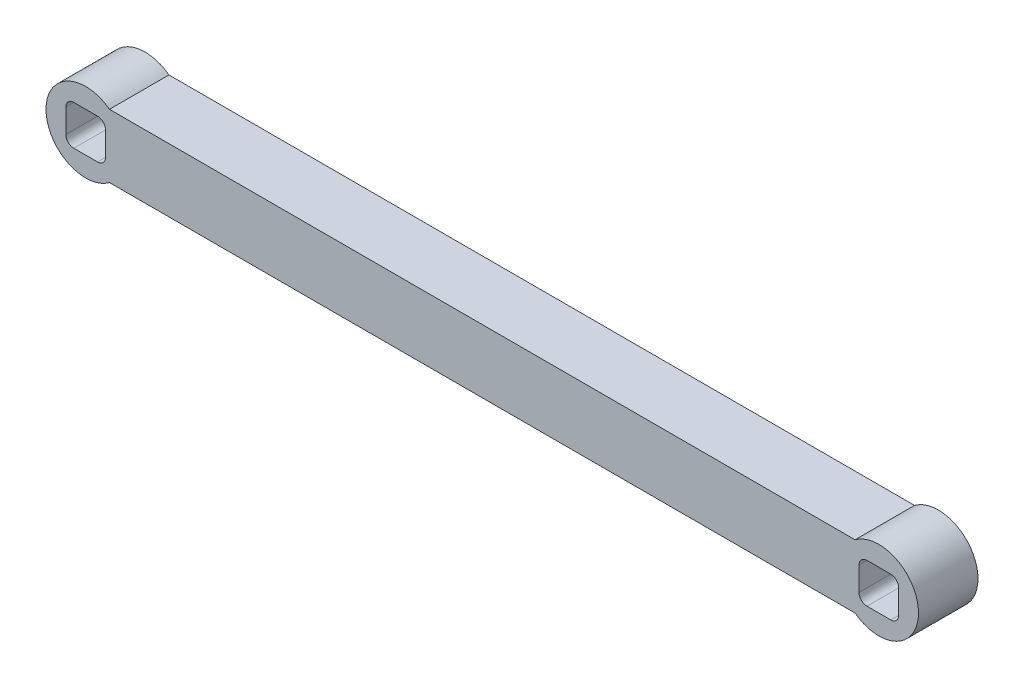
ISO-10303-21;
HEADER;
FILE_DESCRIPTION(('STEP AP214'),'2;1');
FILE_NAME('part.step','',(''),(''),'','','');
FILE_SCHEMA(('AUTOMOTIVE_DESIGN { 1 0 10303 214 1 1 1 1 }'));
ENDSEC;
DATA;
#1=APPLICATION_CONTEXT('core data for automotive mechanical design processes');
#2=APPLICATION_PROTOCOL_DEFINITION('international standard','automotive_design',2000,#1);
#3=PRODUCT_CONTEXT('',#1,'mechanical');
#4=PRODUCT('Part','Part','',(#3));
#5=PRODUCT_RELATED_PRODUCT_CATEGORY('part','',(#4));
#6=PRODUCT_DEFINITION_FORMATION('','',#4);
#7=PRODUCT_DEFINITION_CONTEXT('part definition',#1,'design');
#8=PRODUCT_DEFINITION('design','',#6,#7);
#9=PRODUCT_DEFINITION_SHAPE('','',#8);
#10=(LENGTH_UNIT() NAMED_UNIT(*) SI_UNIT(.MILLI.,.METRE.));
#11=(NAMED_UNIT(*) PLANE_ANGLE_UNIT() SI_UNIT($,.RADIAN.));
#12=(NAMED_UNIT(*) SI_UNIT($,.STERADIAN.) SOLID_ANGLE_UNIT());
#13=UNCERTAINTY_MEASURE_WITH_UNIT(LENGTH_MEASURE(1.E-05),#10,'distance_accuracy_value','');
#14=(GEOMETRIC_REPRESENTATION_CONTEXT(3) GLOBAL_UNCERTAINTY_ASSIGNED_CONTEXT((#13)) GLOBAL_UNIT_ASSIGNED_CONTEXT((#10,
#11,#12)) REPRESENTATION_CONTEXT('',''));
#15=CARTESIAN_POINT('',(0.,0.,0.));
#16=DIRECTION('',(0.,0.,1.));
#17=DIRECTION('',(1.,0.,0.));
#18=AXIS2_PLACEMENT_3D('',#15,#16,#17);
#19=CARTESIAN_POINT('',(-52.5,0.,7.5));
#20=DIRECTION('',(-1.,0.,0.));
#21=DIRECTION('',(0.,0.,1.));
#22=AXIS2_PLACEMENT_3D('',#19,#20,#21);
#23=PLANE('',#22);
#24=DIRECTION('',(0.,1.,0.));
#25=VECTOR('',#24,1.);
#26=CARTESIAN_POINT('',(-52.5,0.,0.));
#27=LINE('',#26,#25);
#28=CARTESIAN_POINT('',(-52.5,-1.50000000000001,0.));
#29=VERTEX_POINT('',#28);
#30=CARTESIAN_POINT('',(-52.5,1.49999999999999,0.));
#31=VERTEX_POINT('',#30);
#32=EDGE_CURVE('E243',#29,#31,#27,.T.);
#33=ORIENTED_EDGE('',*,*,#32,.T.);
#34=DIRECTION('',(0.,0.,-1.));
#35=VECTOR('',#34,1.);
#36=CARTESIAN_POINT('',(-52.5,1.49999999999999,7.5));
#37=LINE('',#36,#35);
#38=CARTESIAN_POINT('',(-52.5,1.49999999999999,7.5));
#39=VERTEX_POINT('',#38);
#40=EDGE_CURVE('E11',#39,#31,#37,.T.);
#41=ORIENTED_EDGE('',*,*,#40,.F.);
#42=DIRECTION('',(0.,1.,0.));
#43=VECTOR('',#42,1.);
#44=CARTESIAN_POINT('',(-52.5,0.,7.5));
#45=LINE('',#44,#43);
#46=CARTESIAN_POINT('',(-52.5,-1.50000000000001,7.5));
#47=VERTEX_POINT('',#46);
#48=EDGE_CURVE('E345',#47,#39,#45,.T.);
#49=ORIENTED_EDGE('',*,*,#48,.F.);
#50=DIRECTION('',(0.,0.,-1.));
#51=VECTOR('',#50,1.);
#52=CARTESIAN_POINT('',(-52.5,-1.50000000000001,7.5));
#53=LINE('',#52,#51);
#54=EDGE_CURVE('E261',#47,#29,#53,.T.);
#55=ORIENTED_EDGE('',*,*,#54,.T.);
#56=EDGE_LOOP('',(#33,#41,#49,#55));
#57=FACE_BOUND('',#56,.T.);
#58=ADVANCED_FACE('F39',(#57),#23,.F.);
#59=CARTESIAN_POINT('',(-51.5,1.49999999999999,7.5));
#60=DIRECTION('',(0.,0.,-1.));
#61=DIRECTION('',(-1.,0.,0.));
#62=AXIS2_PLACEMENT_3D('',#59,#60,#61);
#63=CYLINDRICAL_SURFACE('',#62,1.);
#64=CARTESIAN_POINT('',(-51.5,1.49999999999999,0.));
#65=DIRECTION('',(0.,0.,1.));
#66=DIRECTION('',(1.,0.,0.));
#67=AXIS2_PLACEMENT_3D('',#64,#65,#66);
#68=CIRCLE('',#67,1.);
#69=CARTESIAN_POINT('',(-51.5,2.49999999999999,0.));
#70=VERTEX_POINT('',#69);
#71=EDGE_CURVE('E246',#31,#70,#68,.F.);
#72=ORIENTED_EDGE('',*,*,#71,.T.);
#73=DIRECTION('',(0.,0.,-1.));
#74=VECTOR('',#73,1.);
#75=CARTESIAN_POINT('',(-51.5,2.49999999999999,7.5));
#76=LINE('',#75,#74);
#77=CARTESIAN_POINT('',(-51.5,2.49999999999999,7.5));
#78=VERTEX_POINT('',#77);
#79=EDGE_CURVE('E49',#78,#70,#76,.T.);
#80=ORIENTED_EDGE('',*,*,#79,.F.);
#81=CARTESIAN_POINT('',(-51.5,1.49999999999999,7.5));
#82=DIRECTION('',(0.,0.,1.));
#83=DIRECTION('',(1.,0.,0.));
#84=AXIS2_PLACEMENT_3D('',#81,#82,#83);
#85=CIRCLE('',#84,1.);
#86=EDGE_CURVE('E347',#39,#78,#85,.F.);
#87=ORIENTED_EDGE('',*,*,#86,.F.);
#88=ORIENTED_EDGE('',*,*,#40,.T.);
#89=EDGE_LOOP('',(#72,#80,#87,#88));
#90=FACE_BOUND('',#89,.T.);
#91=ADVANCED_FACE('F376',(#90),#63,.F.);
#92=CARTESIAN_POINT('',(0.,2.49999999999999,7.5));
#93=DIRECTION('',(0.,1.,0.));
#94=DIRECTION('',(0.,0.,1.));
#95=AXIS2_PLACEMENT_3D('',#92,#93,#94);
#96=PLANE('',#95);
#97=DIRECTION('',(1.,0.,0.));
#98=VECTOR('',#97,1.);
#99=CARTESIAN_POINT('',(0.,2.49999999999999,0.));
#100=LINE('',#99,#98);
#101=CARTESIAN_POINT('',(-48.5,2.49999999999999,0.));
#102=VERTEX_POINT('',#101);
#103=EDGE_CURVE('E248',#70,#102,#100,.T.);
#104=ORIENTED_EDGE('',*,*,#103,.T.);
#105=DIRECTION('',(0.,0.,-1.));
#106=VECTOR('',#105,1.);
#107=CARTESIAN_POINT('',(-48.5,2.49999999999999,7.5));
#108=LINE('',#107,#106);
#109=CARTESIAN_POINT('',(-48.5,2.49999999999999,7.5));
#110=VERTEX_POINT('',#109);
#111=EDGE_CURVE('E268',#110,#102,#108,.T.);
#112=ORIENTED_EDGE('',*,*,#111,.F.);
#113=DIRECTION('',(1.,0.,0.));
#114=VECTOR('',#113,1.);
#115=CARTESIAN_POINT('',(0.,2.49999999999999,7.5));
#116=LINE('',#115,#114);
#117=EDGE_CURVE('E349',#78,#110,#116,.T.);
#118=ORIENTED_EDGE('',*,*,#117,.F.);
#119=ORIENTED_EDGE('',*,*,#79,.T.);
#120=EDGE_LOOP('',(#104,#112,#118,#119));
#121=FACE_BOUND('',#120,.T.);
#122=ADVANCED_FACE('F381',(#121),#96,.F.);
#123=CARTESIAN_POINT('',(-48.5,1.49999999999999,7.5));
#124=DIRECTION('',(0.,0.,-1.));
#125=DIRECTION('',(-1.,0.,0.));
#126=AXIS2_PLACEMENT_3D('',#123,#124,#125);
#127=CYLINDRICAL_SURFACE('',#126,1.);
#128=CARTESIAN_POINT('',(-48.5,1.49999999999999,0.));
#129=DIRECTION('',(0.,0.,1.));
#130=DIRECTION('',(1.,0.,0.));
#131=AXIS2_PLACEMENT_3D('',#128,#129,#130);
#132=CIRCLE('',#131,1.);
#133=CARTESIAN_POINT('',(-47.5,1.49999999999999,0.));
#134=VERTEX_POINT('',#133);
#135=EDGE_CURVE('E250',#102,#134,#132,.F.);
#136=ORIENTED_EDGE('',*,*,#135,.T.);
#137=DIRECTION('',(0.,0.,-1.));
#138=VECTOR('',#137,1.);
#139=CARTESIAN_POINT('',(-47.5,1.49999999999999,7.5));
#140=LINE('',#139,#138);
#141=CARTESIAN_POINT('',(-47.5,1.49999999999999,7.5));
#142=VERTEX_POINT('',#141);
#143=EDGE_CURVE('E266',#142,#134,#140,.T.);
#144=ORIENTED_EDGE('',*,*,#143,.F.);
#145=CARTESIAN_POINT('',(-48.5,1.49999999999999,7.5));
#146=DIRECTION('',(0.,0.,1.));
#147=DIRECTION('',(1.,0.,0.));
#148=AXIS2_PLACEMENT_3D('',#145,#146,#147);
#149=CIRCLE('',#148,1.);
#150=EDGE_CURVE('E351',#110,#142,#149,.F.);
#151=ORIENTED_EDGE('',*,*,#150,.F.);
#152=ORIENTED_EDGE('',*,*,#111,.T.);
#153=EDGE_LOOP('',(#136,#144,#151,#152));
#154=FACE_BOUND('',#153,.T.);
#155=ADVANCED_FACE('F469',(#154),#127,.F.);
#156=CARTESIAN_POINT('',(-47.5,0.,7.5));
#157=DIRECTION('',(-1.,0.,0.));
#158=DIRECTION('',(0.,0.,1.));
#159=AXIS2_PLACEMENT_3D('',#156,#157,#158);
#160=PLANE('',#159);
#161=DIRECTION('',(0.,1.,0.));
#162=VECTOR('',#161,1.);
#163=CARTESIAN_POINT('',(-47.5,0.,0.));
#164=LINE('',#163,#162);
#165=CARTESIAN_POINT('',(-47.5,-1.50000000000001,0.));
#166=VERTEX_POINT('',#165);
#167=EDGE_CURVE('E253',#166,#134,#164,.T.);
#168=ORIENTED_EDGE('',*,*,#167,.F.);
#169=DIRECTION('',(0.,0.,-1.));
#170=VECTOR('',#169,1.);
#171=CARTESIAN_POINT('',(-47.5,-1.50000000000001,7.5));
#172=LINE('',#171,#170);
#173=CARTESIAN_POINT('',(-47.5,-1.50000000000001,7.5));
#174=VERTEX_POINT('',#173);
#175=EDGE_CURVE('E195',#174,#166,#172,.T.);
#176=ORIENTED_EDGE('',*,*,#175,.F.);
#177=DIRECTION('',(0.,1.,0.));
#178=VECTOR('',#177,1.);
#179=CARTESIAN_POINT('',(-47.5,0.,7.5));
#180=LINE('',#179,#178);
#181=EDGE_CURVE('E201',#174,#142,#180,.T.);
#182=ORIENTED_EDGE('',*,*,#181,.T.);
#183=ORIENTED_EDGE('',*,*,#143,.T.);
#184=EDGE_LOOP('',(#168,#176,#182,#183));
#185=FACE_BOUND('',#184,.T.);
#186=ADVANCED_FACE('F354',(#185),#160,.T.);
#187=CARTESIAN_POINT('',(-48.5,-1.50000000000001,7.5));
#188=DIRECTION('',(0.,0.,-1.));
#189=DIRECTION('',(-1.,0.,0.));
#190=AXIS2_PLACEMENT_3D('',#187,#188,#189);
#191=CYLINDRICAL_SURFACE('',#190,1.);
#192=CARTESIAN_POINT('',(-48.5,-1.50000000000001,0.));
#193=DIRECTION('',(0.,0.,1.));
#194=DIRECTION('',(1.,0.,0.));
#195=AXIS2_PLACEMENT_3D('',#192,#193,#194);
#196=CIRCLE('',#195,1.);
#197=CARTESIAN_POINT('',(-48.5,-2.50000000000001,0.));
#198=VERTEX_POINT('',#197);
#199=EDGE_CURVE('E190',#198,#166,#196,.T.);
#200=ORIENTED_EDGE('',*,*,#199,.F.);
#201=DIRECTION('',(0.,0.,-1.));
#202=VECTOR('',#201,1.);
#203=CARTESIAN_POINT('',(-48.5,-2.50000000000001,7.5));
#204=LINE('',#203,#202);
#205=CARTESIAN_POINT('',(-48.5,-2.50000000000001,7.5));
#206=VERTEX_POINT('',#205);
#207=EDGE_CURVE('E185',#206,#198,#204,.T.);
#208=ORIENTED_EDGE('',*,*,#207,.F.);
#209=CARTESIAN_POINT('',(-48.5,-1.50000000000001,7.5));
#210=DIRECTION('',(0.,0.,1.));
#211=DIRECTION('',(1.,0.,0.));
#212=AXIS2_PLACEMENT_3D('',#209,#210,#211);
#213=CIRCLE('',#212,1.);
#214=EDGE_CURVE('E188',#206,#174,#213,.T.);
#215=ORIENTED_EDGE('',*,*,#214,.T.);
#216=ORIENTED_EDGE('',*,*,#175,.T.);
#217=EDGE_LOOP('',(#200,#208,#215,#216));
#218=FACE_BOUND('',#217,.T.);
#219=ADVANCED_FACE('F187',(#218),#191,.F.);
#220=CARTESIAN_POINT('',(0.,-2.50000000000001,7.5));
#221=DIRECTION('',(0.,1.,0.));
#222=DIRECTION('',(0.,0.,1.));
#223=AXIS2_PLACEMENT_3D('',#220,#221,#222);
#224=PLANE('',#223);
#225=DIRECTION('',(1.,0.,0.));
#226=VECTOR('',#225,1.);
#227=CARTESIAN_POINT('',(0.,-2.50000000000001,0.));
#228=LINE('',#227,#226);
#229=CARTESIAN_POINT('',(-51.5,-2.50000000000001,0.));
#230=VERTEX_POINT('',#229);
#231=EDGE_CURVE('E257',#230,#198,#228,.T.);
#232=ORIENTED_EDGE('',*,*,#231,.F.);
#233=DIRECTION('',(0.,0.,-1.));
#234=VECTOR('',#233,1.);
#235=CARTESIAN_POINT('',(-51.5,-2.50000000000001,7.5));
#236=LINE('',#235,#234);
#237=CARTESIAN_POINT('',(-51.5,-2.50000000000001,7.5));
#238=VERTEX_POINT('',#237);
#239=EDGE_CURVE('E122',#238,#230,#236,.T.);
#240=ORIENTED_EDGE('',*,*,#239,.F.);
#241=DIRECTION('',(1.,0.,0.));
#242=VECTOR('',#241,1.);
#243=CARTESIAN_POINT('',(0.,-2.50000000000001,7.5));
#244=LINE('',#243,#242);
#245=EDGE_CURVE('E199',#238,#206,#244,.T.);
#246=ORIENTED_EDGE('',*,*,#245,.T.);
#247=ORIENTED_EDGE('',*,*,#207,.T.);
#248=EDGE_LOOP('',(#232,#240,#246,#247));
#249=FACE_BOUND('',#248,.T.);
#250=ADVANCED_FACE('F203',(#249),#224,.T.);
#251=CARTESIAN_POINT('',(51.5,1.49999999999999,7.5));
#252=DIRECTION('',(0.,0.,-1.));
#253=DIRECTION('',(-1.,0.,0.));
#254=AXIS2_PLACEMENT_3D('',#251,#252,#253);
#255=CYLINDRICAL_SURFACE('',#254,1.);
#256=CARTESIAN_POINT('',(51.5,1.49999999999999,0.));
#257=DIRECTION('',(0.,0.,1.));
#258=DIRECTION('',(1.,0.,0.));
#259=AXIS2_PLACEMENT_3D('',#256,#257,#258);
#260=CIRCLE('',#259,1.);
#261=CARTESIAN_POINT('',(52.5,1.49999999999999,0.));
#262=VERTEX_POINT('',#261);
#263=CARTESIAN_POINT('',(51.5,2.49999999999999,0.));
#264=VERTEX_POINT('',#263);
#265=EDGE_CURVE('E219',#262,#264,#260,.T.);
#266=ORIENTED_EDGE('',*,*,#265,.F.);
#267=DIRECTION('',(0.,0.,-1.));
#268=VECTOR('',#267,1.);
#269=CARTESIAN_POINT('',(52.5,1.49999999999999,7.5));
#270=LINE('',#269,#268);
#271=CARTESIAN_POINT('',(52.5,1.49999999999999,7.5));
#272=VERTEX_POINT('',#271);
#273=EDGE_CURVE('E263',#272,#262,#270,.T.);
#274=ORIENTED_EDGE('',*,*,#273,.F.);
#275=CARTESIAN_POINT('',(51.5,1.49999999999999,7.5));
#276=DIRECTION('',(0.,0.,1.));
#277=DIRECTION('',(1.,0.,0.));
#278=AXIS2_PLACEMENT_3D('',#275,#276,#277);
#279=CIRCLE('',#278,1.);
#280=CARTESIAN_POINT('',(51.5,2.49999999999999,7.5));
#281=VERTEX_POINT('',#280);
#282=EDGE_CURVE('E318',#272,#281,#279,.T.);
#283=ORIENTED_EDGE('',*,*,#282,.T.);
#284=DIRECTION('',(0.,0.,-1.));
#285=VECTOR('',#284,1.);
#286=CARTESIAN_POINT('',(51.5,2.49999999999999,7.5));
#287=LINE('',#286,#285);
#288=EDGE_CURVE('E273',#281,#264,#287,.T.);
#289=ORIENTED_EDGE('',*,*,#288,.T.);
#290=EDGE_LOOP('',(#266,#274,#283,#289));
#291=FACE_BOUND('',#290,.T.);
#292=ADVANCED_FACE('F412',(#291),#255,.F.);
#293=CARTESIAN_POINT('',(52.5,0.,7.5));
#294=DIRECTION('',(-1.,0.,0.));
#295=DIRECTION('',(0.,0.,1.));
#296=AXIS2_PLACEMENT_3D('',#293,#294,#295);
#297=PLANE('',#296);
#298=DIRECTION('',(0.,1.,0.));
#299=VECTOR('',#298,1.);
#300=CARTESIAN_POINT('',(52.5,0.,0.));
#301=LINE('',#300,#299);
#302=CARTESIAN_POINT('',(52.5,-1.50000000000001,0.));
#303=VERTEX_POINT('',#302);
#304=EDGE_CURVE('E222',#303,#262,#301,.T.);
#305=ORIENTED_EDGE('',*,*,#304,.F.);
#306=DIRECTION('',(0.,0.,-1.));
#307=VECTOR('',#306,1.);
#308=CARTESIAN_POINT('',(52.5,-1.50000000000001,7.5));
#309=LINE('',#308,#307);
#310=CARTESIAN_POINT('',(52.5,-1.50000000000001,7.5));
#311=VERTEX_POINT('',#310);
#312=EDGE_CURVE('E287',#311,#303,#309,.T.);
#313=ORIENTED_EDGE('',*,*,#312,.F.);
#314=DIRECTION('',(0.,1.,0.));
#315=VECTOR('',#314,1.);
#316=CARTESIAN_POINT('',(52.5,0.,7.5));
#317=LINE('',#316,#315);
#318=EDGE_CURVE('E325',#311,#272,#317,.T.);
#319=ORIENTED_EDGE('',*,*,#318,.T.);
#320=ORIENTED_EDGE('',*,*,#273,.T.);
#321=EDGE_LOOP('',(#305,#313,#319,#320));
#322=FACE_BOUND('',#321,.T.);
#323=ADVANCED_FACE('F408',(#322),#297,.T.);
#324=CARTESIAN_POINT('',(51.5,-1.50000000000001,7.5));
#325=DIRECTION('',(0.,0.,-1.));
#326=DIRECTION('',(-1.,0.,0.));
#327=AXIS2_PLACEMENT_3D('',#324,#325,#326);
#328=CYLINDRICAL_SURFACE('',#327,1.);
#329=CARTESIAN_POINT('',(51.5,-1.50000000000001,0.));
#330=DIRECTION('',(0.,0.,1.));
#331=DIRECTION('',(1.,0.,0.));
#332=AXIS2_PLACEMENT_3D('',#329,#330,#331);
#333=CIRCLE('',#332,1.);
#334=CARTESIAN_POINT('',(51.5,-2.50000000000001,0.));
#335=VERTEX_POINT('',#334);
#336=EDGE_CURVE('E225',#335,#303,#333,.T.);
#337=ORIENTED_EDGE('',*,*,#336,.F.);
#338=DIRECTION('',(0.,0.,-1.));
#339=VECTOR('',#338,1.);
#340=CARTESIAN_POINT('',(51.5,-2.50000000000001,7.5));
#341=LINE('',#340,#339);
#342=CARTESIAN_POINT('',(51.5,-2.50000000000001,7.5));
#343=VERTEX_POINT('',#342);
#344=EDGE_CURVE('E285',#343,#335,#341,.T.);
#345=ORIENTED_EDGE('',*,*,#344,.F.);
#346=CARTESIAN_POINT('',(51.5,-1.50000000000001,7.5));
#347=DIRECTION('',(0.,0.,1.));
#348=DIRECTION('',(1.,0.,0.));
#349=AXIS2_PLACEMENT_3D('',#346,#347,#348);
#350=CIRCLE('',#349,1.);
#351=EDGE_CURVE('E328',#343,#311,#350,.T.);
#352=ORIENTED_EDGE('',*,*,#351,.T.);
#353=ORIENTED_EDGE('',*,*,#312,.T.);
#354=EDGE_LOOP('',(#337,#345,#352,#353));
#355=FACE_BOUND('',#354,.T.);
#356=ADVANCED_FACE('F404',(#355),#328,.F.);
#357=CARTESIAN_POINT('',(0.,-2.50000000000001,7.5));
#358=DIRECTION('',(0.,-1.,0.));
#359=DIRECTION('',(0.,0.,-1.));
#360=AXIS2_PLACEMENT_3D('',#357,#358,#359);
#361=PLANE('',#360);
#362=DIRECTION('',(-1.,0.,0.));
#363=VECTOR('',#362,1.);
#364=CARTESIAN_POINT('',(0.,-2.50000000000001,0.));
#365=LINE('',#364,#363);
#366=CARTESIAN_POINT('',(48.5,-2.50000000000001,0.));
#367=VERTEX_POINT('',#366);
#368=EDGE_CURVE('E228',#335,#367,#365,.T.);
#369=ORIENTED_EDGE('',*,*,#368,.T.);
#370=DIRECTION('',(0.,0.,-1.));
#371=VECTOR('',#370,1.);
#372=CARTESIAN_POINT('',(48.5,-2.50000000000001,7.5));
#373=LINE('',#372,#371);
#374=CARTESIAN_POINT('',(48.5,-2.50000000000001,7.5));
#375=VERTEX_POINT('',#374);
#376=EDGE_CURVE('E282',#375,#367,#373,.T.);
#377=ORIENTED_EDGE('',*,*,#376,.F.);
#378=DIRECTION('',(-1.,0.,0.));
#379=VECTOR('',#378,1.);
#380=CARTESIAN_POINT('',(0.,-2.50000000000001,7.5));
#381=LINE('',#380,#379);
#382=EDGE_CURVE('E331',#343,#375,#381,.T.);
#383=ORIENTED_EDGE('',*,*,#382,.F.);
#384=ORIENTED_EDGE('',*,*,#344,.T.);
#385=EDGE_LOOP('',(#369,#377,#383,#384));
#386=FACE_BOUND('',#385,.T.);
#387=ADVANCED_FACE('F400',(#386),#361,.F.);
#388=CARTESIAN_POINT('',(48.5,-1.50000000000001,7.5));
#389=DIRECTION('',(0.,0.,-1.));
#390=DIRECTION('',(-1.,0.,0.));
#391=AXIS2_PLACEMENT_3D('',#388,#389,#390);
#392=CYLINDRICAL_SURFACE('',#391,1.);
#393=CARTESIAN_POINT('',(48.5,-1.50000000000001,0.));
#394=DIRECTION('',(0.,0.,1.));
#395=DIRECTION('',(1.,0.,0.));
#396=AXIS2_PLACEMENT_3D('',#393,#394,#395);
#397=CIRCLE('',#396,1.);
#398=CARTESIAN_POINT('',(47.5,-1.50000000000001,0.));
#399=VERTEX_POINT('',#398);
#400=EDGE_CURVE('E231',#367,#399,#397,.F.);
#401=ORIENTED_EDGE('',*,*,#400,.T.);
#402=DIRECTION('',(0.,0.,-1.));
#403=VECTOR('',#402,1.);
#404=CARTESIAN_POINT('',(47.5,-1.50000000000001,7.5));
#405=LINE('',#404,#403);
#406=CARTESIAN_POINT('',(47.5,-1.50000000000001,7.5));
#407=VERTEX_POINT('',#406);
#408=EDGE_CURVE('E279',#407,#399,#405,.T.);
#409=ORIENTED_EDGE('',*,*,#408,.F.);
#410=CARTESIAN_POINT('',(48.5,-1.50000000000001,7.5));
#411=DIRECTION('',(0.,0.,1.));
#412=DIRECTION('',(1.,0.,0.));
#413=AXIS2_PLACEMENT_3D('',#410,#411,#412);
#414=CIRCLE('',#413,1.);
#415=EDGE_CURVE('E334',#375,#407,#414,.F.);
#416=ORIENTED_EDGE('',*,*,#415,.F.);
#417=ORIENTED_EDGE('',*,*,#376,.T.);
#418=EDGE_LOOP('',(#401,#409,#416,#417));
#419=FACE_BOUND('',#418,.T.);
#420=ADVANCED_FACE('F396',(#419),#392,.F.);
#421=CARTESIAN_POINT('',(47.5,0.,7.5));
#422=DIRECTION('',(-1.,0.,0.));
#423=DIRECTION('',(0.,0.,1.));
#424=AXIS2_PLACEMENT_3D('',#421,#422,#423);
#425=PLANE('',#424);
#426=DIRECTION('',(0.,1.,0.));
#427=VECTOR('',#426,1.);
#428=CARTESIAN_POINT('',(47.5,0.,0.));
#429=LINE('',#428,#427);
#430=CARTESIAN_POINT('',(47.5,1.49999999999999,0.));
#431=VERTEX_POINT('',#430);
#432=EDGE_CURVE('E234',#399,#431,#429,.T.);
#433=ORIENTED_EDGE('',*,*,#432,.T.);
#434=DIRECTION('',(0.,0.,-1.));
#435=VECTOR('',#434,1.);
#436=CARTESIAN_POINT('',(47.5,1.49999999999999,7.5));
#437=LINE('',#436,#435);
#438=CARTESIAN_POINT('',(47.5,1.49999999999999,7.5));
#439=VERTEX_POINT('',#438);
#440=EDGE_CURVE('E277',#439,#431,#437,.T.);
#441=ORIENTED_EDGE('',*,*,#440,.F.);
#442=DIRECTION('',(0.,1.,0.));
#443=VECTOR('',#442,1.);
#444=CARTESIAN_POINT('',(47.5,0.,7.5));
#445=LINE('',#444,#443);
#446=EDGE_CURVE('E337',#407,#439,#445,.T.);
#447=ORIENTED_EDGE('',*,*,#446,.F.);
#448=ORIENTED_EDGE('',*,*,#408,.T.);
#449=EDGE_LOOP('',(#433,#441,#447,#448));
#450=FACE_BOUND('',#449,.T.);
#451=ADVANCED_FACE('F392',(#450),#425,.F.);
#452=CARTESIAN_POINT('',(48.5,1.49999999999999,7.5));
#453=DIRECTION('',(0.,0.,-1.));
#454=DIRECTION('',(-1.,0.,0.));
#455=AXIS2_PLACEMENT_3D('',#452,#453,#454);
#456=CYLINDRICAL_SURFACE('',#455,1.);
#457=CARTESIAN_POINT('',(48.5,1.49999999999999,0.));
#458=DIRECTION('',(0.,0.,1.));
#459=DIRECTION('',(1.,0.,0.));
#460=AXIS2_PLACEMENT_3D('',#457,#458,#459);
#461=CIRCLE('',#460,1.);
#462=CARTESIAN_POINT('',(48.5,2.49999999999999,0.));
#463=VERTEX_POINT('',#462);
#464=EDGE_CURVE('E237',#463,#431,#461,.T.);
#465=ORIENTED_EDGE('',*,*,#464,.F.);
#466=DIRECTION('',(0.,0.,-1.));
#467=VECTOR('',#466,1.);
#468=CARTESIAN_POINT('',(48.5,2.49999999999999,7.5));
#469=LINE('',#468,#467);
#470=CARTESIAN_POINT('',(48.5,2.49999999999999,7.5));
#471=VERTEX_POINT('',#470);
#472=EDGE_CURVE('E275',#471,#463,#469,.T.);
#473=ORIENTED_EDGE('',*,*,#472,.F.);
#474=CARTESIAN_POINT('',(48.5,1.49999999999999,7.5));
#475=DIRECTION('',(0.,0.,1.));
#476=DIRECTION('',(1.,0.,0.));
#477=AXIS2_PLACEMENT_3D('',#474,#475,#476);
#478=CIRCLE('',#477,1.);
#479=EDGE_CURVE('E339',#471,#439,#478,.T.);
#480=ORIENTED_EDGE('',*,*,#479,.T.);
#481=ORIENTED_EDGE('',*,*,#440,.T.);
#482=EDGE_LOOP('',(#465,#473,#480,#481));
#483=FACE_BOUND('',#482,.T.);
#484=ADVANCED_FACE('F389',(#483),#456,.F.);
#485=CARTESIAN_POINT('',(50.,0.,7.5));
#486=DIRECTION('',(0.,0.,-1.));
#487=DIRECTION('',(-1.,0.,0.));
#488=AXIS2_PLACEMENT_3D('',#485,#486,#487);
#489=CYLINDRICAL_SURFACE('',#488,4.99999999999999);
#490=CARTESIAN_POINT('',(50.,0.,0.));
#491=DIRECTION('',(0.,0.,1.));
#492=DIRECTION('',(1.,0.,0.));
#493=AXIS2_PLACEMENT_3D('',#490,#491,#492);
#494=CIRCLE('',#493,4.99999999999999);
#495=CARTESIAN_POINT('',(47.,3.99999999999998,0.));
#496=VERTEX_POINT('',#495);
#497=CARTESIAN_POINT('',(47.,-3.99999999999997,0.));
#498=VERTEX_POINT('',#497);
#499=EDGE_CURVE('E209',#496,#498,#494,.F.);
#500=ORIENTED_EDGE('',*,*,#499,.F.);
#501=DIRECTION('',(0.,0.,-1.));
#502=VECTOR('',#501,1.);
#503=CARTESIAN_POINT('',(47.,3.99999999999998,7.5));
#504=LINE('',#503,#502);
#505=CARTESIAN_POINT('',(47.,3.99999999999998,7.5));
#506=VERTEX_POINT('',#505);
#507=EDGE_CURVE('E43',#506,#496,#504,.T.);
#508=ORIENTED_EDGE('',*,*,#507,.F.);
#509=CARTESIAN_POINT('',(50.,0.,7.5));
#510=DIRECTION('',(0.,0.,1.));
#511=DIRECTION('',(1.,0.,0.));
#512=AXIS2_PLACEMENT_3D('',#509,#510,#511);
#513=CIRCLE('',#512,4.99999999999999);
#514=CARTESIAN_POINT('',(47.,-3.99999999999997,7.5));
#515=VERTEX_POINT('',#514);
#516=EDGE_CURVE('E260',#506,#515,#513,.F.);
#517=ORIENTED_EDGE('',*,*,#516,.T.);
#518=DIRECTION('',(0.,0.,-1.));
#519=VECTOR('',#518,1.);
#520=CARTESIAN_POINT('',(47.,-3.99999999999997,7.5));
#521=LINE('',#520,#519);
#522=EDGE_CURVE('E205',#515,#498,#521,.T.);
#523=ORIENTED_EDGE('',*,*,#522,.T.);
#524=EDGE_LOOP('',(#500,#508,#517,#523));
#525=FACE_BOUND('',#524,.T.);
#526=ADVANCED_FACE('F41',(#525),#489,.T.);
#527=CARTESIAN_POINT('',(0.,3.99999999999998,7.5));
#528=DIRECTION('',(0.,-1.,0.));
#529=DIRECTION('',(0.,0.,-1.));
#530=AXIS2_PLACEMENT_3D('',#527,#528,#529);
#531=PLANE('',#530);
#532=DIRECTION('',(-1.,0.,0.));
#533=VECTOR('',#532,1.);
#534=CARTESIAN_POINT('',(0.,3.99999999999998,0.));
#535=LINE('',#534,#533);
#536=CARTESIAN_POINT('',(-47.,3.99999999999998,0.));
#537=VERTEX_POINT('',#536);
#538=EDGE_CURVE('E212',#496,#537,#535,.T.);
#539=ORIENTED_EDGE('',*,*,#538,.T.);
#540=DIRECTION('',(0.,0.,-1.));
#541=VECTOR('',#540,1.);
#542=CARTESIAN_POINT('',(-47.,3.99999999999998,7.5));
#543=LINE('',#542,#541);
#544=CARTESIAN_POINT('',(-47.,3.99999999999998,7.5));
#545=VERTEX_POINT('',#544);
#546=EDGE_CURVE('E293',#545,#537,#543,.T.);
#547=ORIENTED_EDGE('',*,*,#546,.F.);
#548=DIRECTION('',(-1.,0.,0.));
#549=VECTOR('',#548,1.);
#550=CARTESIAN_POINT('',(0.,3.99999999999998,7.5));
#551=LINE('',#550,#549);
#552=EDGE_CURVE('E302',#506,#545,#551,.T.);
#553=ORIENTED_EDGE('',*,*,#552,.F.);
#554=ORIENTED_EDGE('',*,*,#507,.T.);
#555=EDGE_LOOP('',(#539,#547,#553,#554));
#556=FACE_BOUND('',#555,.T.);
#557=ADVANCED_FACE('F301',(#556),#531,.F.);
#558=CARTESIAN_POINT('',(-50.,0.,7.5));
#559=DIRECTION('',(0.,0.,-1.));
#560=DIRECTION('',(-1.,0.,0.));
#561=AXIS2_PLACEMENT_3D('',#558,#559,#560);
#562=CYLINDRICAL_SURFACE('',#561,5.);
#563=CARTESIAN_POINT('',(-50.,0.,0.));
#564=DIRECTION('',(0.,0.,1.));
#565=DIRECTION('',(1.,0.,0.));
#566=AXIS2_PLACEMENT_3D('',#563,#564,#565);
#567=CIRCLE('',#566,5.);
#568=CARTESIAN_POINT('',(-47.,-3.99999999999999,0.));
#569=VERTEX_POINT('',#568);
#570=EDGE_CURVE('E214',#537,#569,#567,.T.);
#571=ORIENTED_EDGE('',*,*,#570,.T.);
#572=DIRECTION('',(0.,0.,-1.));
#573=VECTOR('',#572,1.);
#574=CARTESIAN_POINT('',(-47.,-3.99999999999999,7.5));
#575=LINE('',#574,#573);
#576=CARTESIAN_POINT('',(-47.,-3.99999999999999,7.5));
#577=VERTEX_POINT('',#576);
#578=EDGE_CURVE('E291',#577,#569,#575,.T.);
#579=ORIENTED_EDGE('',*,*,#578,.F.);
#580=CARTESIAN_POINT('',(-50.,0.,7.5));
#581=DIRECTION('',(0.,0.,1.));
#582=DIRECTION('',(1.,0.,0.));
#583=AXIS2_PLACEMENT_3D('',#580,#581,#582);
#584=CIRCLE('',#583,5.);
#585=EDGE_CURVE('E315',#545,#577,#584,.T.);
#586=ORIENTED_EDGE('',*,*,#585,.F.);
#587=ORIENTED_EDGE('',*,*,#546,.T.);
#588=EDGE_LOOP('',(#571,#579,#586,#587));
#589=FACE_BOUND('',#588,.T.);
#590=ADVANCED_FACE('F314',(#589),#562,.T.);
#591=CARTESIAN_POINT('',(0.,2.49999999999999,7.5));
#592=DIRECTION('',(0.,-1.,0.));
#593=DIRECTION('',(0.,0.,-1.));
#594=AXIS2_PLACEMENT_3D('',#591,#592,#593);
#595=PLANE('',#594);
#596=DIRECTION('',(-1.,0.,0.));
#597=VECTOR('',#596,1.);
#598=CARTESIAN_POINT('',(0.,2.49999999999999,0.));
#599=LINE('',#598,#597);
#600=EDGE_CURVE('E240',#264,#463,#599,.T.);
#601=ORIENTED_EDGE('',*,*,#600,.F.);
#602=ORIENTED_EDGE('',*,*,#288,.F.);
#603=DIRECTION('',(-1.,0.,0.));
#604=VECTOR('',#603,1.);
#605=CARTESIAN_POINT('',(0.,2.49999999999999,7.5));
#606=LINE('',#605,#604);
#607=EDGE_CURVE('E342',#281,#471,#606,.T.);
#608=ORIENTED_EDGE('',*,*,#607,.T.);
#609=ORIENTED_EDGE('',*,*,#472,.T.);
#610=EDGE_LOOP('',(#601,#602,#608,#609));
#611=FACE_BOUND('',#610,.T.);
#612=ADVANCED_FACE('F371',(#611),#595,.T.);
#613=CARTESIAN_POINT('',(0.,-3.99999999999998,7.5));
#614=DIRECTION('',(0.,1.,0.));
#615=DIRECTION('',(-1.,0.,0.));
#616=AXIS2_PLACEMENT_3D('',#613,#614,#615);
#617=PLANE('',#616);
#618=DIRECTION('',(1.,0.,0.));
#619=VECTOR('',#618,1.);
#620=CARTESIAN_POINT('',(0.,-3.99999999999998,0.));
#621=LINE('',#620,#619);
#622=EDGE_CURVE('E216',#569,#498,#621,.T.);
#623=ORIENTED_EDGE('',*,*,#622,.T.);
#624=ORIENTED_EDGE('',*,*,#522,.F.);
#625=DIRECTION('',(1.,0.,0.));
#626=VECTOR('',#625,1.);
#627=CARTESIAN_POINT('',(0.,-3.99999999999998,7.5));
#628=LINE('',#627,#626);
#629=EDGE_CURVE('E313',#577,#515,#628,.T.);
#630=ORIENTED_EDGE('',*,*,#629,.F.);
#631=ORIENTED_EDGE('',*,*,#578,.T.);
#632=EDGE_LOOP('',(#623,#624,#630,#631));
#633=FACE_BOUND('',#632,.T.);
#634=ADVANCED_FACE('F311',(#633),#617,.F.);
#635=CARTESIAN_POINT('',(-51.5,-1.50000000000001,7.5));
#636=DIRECTION('',(0.,0.,-1.));
#637=DIRECTION('',(-1.,0.,0.));
#638=AXIS2_PLACEMENT_3D('',#635,#636,#637);
#639=CYLINDRICAL_SURFACE('',#638,1.);
#640=CARTESIAN_POINT('',(-51.5,-1.50000000000001,0.));
#641=DIRECTION('',(0.,0.,1.));
#642=DIRECTION('',(1.,0.,0.));
#643=AXIS2_PLACEMENT_3D('',#640,#641,#642);
#644=CIRCLE('',#643,1.);
#645=EDGE_CURVE('E125',#230,#29,#644,.F.);
#646=ORIENTED_EDGE('',*,*,#645,.T.);
#647=ORIENTED_EDGE('',*,*,#54,.F.);
#648=CARTESIAN_POINT('',(-51.5,-1.50000000000001,7.5));
#649=DIRECTION('',(0.,0.,1.));
#650=DIRECTION('',(1.,0.,0.));
#651=AXIS2_PLACEMENT_3D('',#648,#649,#650);
#652=CIRCLE('',#651,1.);
#653=EDGE_CURVE('E58',#238,#47,#652,.F.);
#654=ORIENTED_EDGE('',*,*,#653,.F.);
#655=ORIENTED_EDGE('',*,*,#239,.T.);
#656=EDGE_LOOP('',(#646,#647,#654,#655));
#657=FACE_BOUND('',#656,.T.);
#658=ADVANCED_FACE('F363',(#657),#639,.F.);
#659=CARTESIAN_POINT('',(0.,0.,7.5));
#660=DIRECTION('',(0.,0.,1.));
#661=DIRECTION('',(1.,0.,0.));
#662=AXIS2_PLACEMENT_3D('',#659,#660,#661);
#663=PLANE('',#662);
#664=ORIENTED_EDGE('',*,*,#516,.F.);
#665=ORIENTED_EDGE('',*,*,#552,.T.);
#666=ORIENTED_EDGE('',*,*,#585,.T.);
#667=ORIENTED_EDGE('',*,*,#629,.T.);
#668=EDGE_LOOP('',(#664,#665,#666,#667));
#669=FACE_BOUND('',#668,.T.);
#670=ORIENTED_EDGE('',*,*,#282,.F.);
#671=ORIENTED_EDGE('',*,*,#318,.F.);
#672=ORIENTED_EDGE('',*,*,#351,.F.);
#673=ORIENTED_EDGE('',*,*,#382,.T.);
#674=ORIENTED_EDGE('',*,*,#415,.T.);
#675=ORIENTED_EDGE('',*,*,#446,.T.);
#676=ORIENTED_EDGE('',*,*,#479,.F.);
#677=ORIENTED_EDGE('',*,*,#607,.F.);
#678=EDGE_LOOP('',(#670,#671,#672,#673,#674,#675,#676,#677));
#679=FACE_BOUND('',#678,.T.);
#680=ORIENTED_EDGE('',*,*,#48,.T.);
#681=ORIENTED_EDGE('',*,*,#86,.T.);
#682=ORIENTED_EDGE('',*,*,#117,.T.);
#683=ORIENTED_EDGE('',*,*,#150,.T.);
#684=ORIENTED_EDGE('',*,*,#181,.F.);
#685=ORIENTED_EDGE('',*,*,#214,.F.);
#686=ORIENTED_EDGE('',*,*,#245,.F.);
#687=ORIENTED_EDGE('',*,*,#653,.T.);
#688=EDGE_LOOP('',(#680,#681,#682,#683,#684,#685,#686,#687));
#689=FACE_BOUND('',#688,.T.);
#690=ADVANCED_FACE('F198',(#669,#679,#689),#663,.T.);
#691=CARTESIAN_POINT('',(0.,0.,0.));
#692=DIRECTION('',(0.,0.,1.));
#693=DIRECTION('',(1.,0.,0.));
#694=AXIS2_PLACEMENT_3D('',#691,#692,#693);
#695=PLANE('',#694);
#696=ORIENTED_EDGE('',*,*,#499,.T.);
#697=ORIENTED_EDGE('',*,*,#622,.F.);
#698=ORIENTED_EDGE('',*,*,#570,.F.);
#699=ORIENTED_EDGE('',*,*,#538,.F.);
#700=EDGE_LOOP('',(#696,#697,#698,#699));
#701=FACE_BOUND('',#700,.T.);
#702=ORIENTED_EDGE('',*,*,#265,.T.);
#703=ORIENTED_EDGE('',*,*,#600,.T.);
#704=ORIENTED_EDGE('',*,*,#464,.T.);
#705=ORIENTED_EDGE('',*,*,#432,.F.);
#706=ORIENTED_EDGE('',*,*,#400,.F.);
#707=ORIENTED_EDGE('',*,*,#368,.F.);
#708=ORIENTED_EDGE('',*,*,#336,.T.);
#709=ORIENTED_EDGE('',*,*,#304,.T.);
#710=EDGE_LOOP('',(#702,#703,#704,#705,#706,#707,#708,#709));
#711=FACE_BOUND('',#710,.T.);
#712=ORIENTED_EDGE('',*,*,#32,.F.);
#713=ORIENTED_EDGE('',*,*,#645,.F.);
#714=ORIENTED_EDGE('',*,*,#231,.T.);
#715=ORIENTED_EDGE('',*,*,#199,.T.);
#716=ORIENTED_EDGE('',*,*,#167,.T.);
#717=ORIENTED_EDGE('',*,*,#135,.F.);
#718=ORIENTED_EDGE('',*,*,#103,.F.);
#719=ORIENTED_EDGE('',*,*,#71,.F.);
#720=EDGE_LOOP('',(#712,#713,#714,#715,#716,#717,#718,#719));
#721=FACE_BOUND('',#720,.T.);
#722=ADVANCED_FACE('F305',(#701,#711,#721),#695,.F.);
#723=CLOSED_SHELL('',(#58,#91,#122,#155,#186,#219,#250,#292,#323,#356,#387,#420,#451,#484,#526,
#557,#590,#612,#634,#658,#690,#722));
#724=MANIFOLD_SOLID_BREP('B2',#723);
#725=ADVANCED_BREP_SHAPE_REPRESENTATION('',(#18,#724),#14);
#726=SHAPE_DEFINITION_REPRESENTATION(#9,#725);
ENDSEC;
END-ISO-10303-21;
